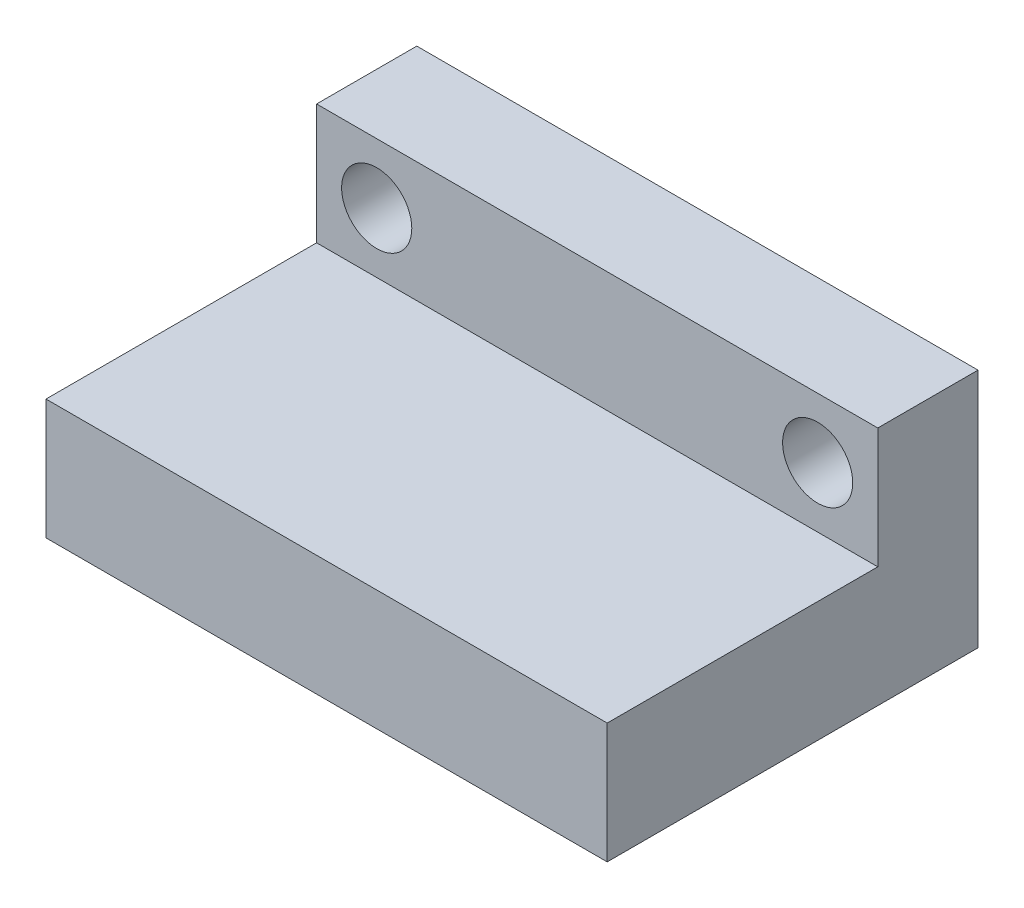
ISO-10303-21;
HEADER;
FILE_DESCRIPTION(('STEP AP214'),'2;1');
FILE_NAME('part.step','',(''),(''),'','','');
FILE_SCHEMA(('AUTOMOTIVE_DESIGN { 1 0 10303 214 1 1 1 1 }'));
ENDSEC;
DATA;
#1=APPLICATION_CONTEXT('core data for automotive mechanical design processes');
#2=APPLICATION_PROTOCOL_DEFINITION('international standard','automotive_design',2000,#1);
#3=PRODUCT_CONTEXT('',#1,'mechanical');
#4=PRODUCT('Part','Part','',(#3));
#5=PRODUCT_RELATED_PRODUCT_CATEGORY('part','',(#4));
#6=PRODUCT_DEFINITION_FORMATION('','',#4);
#7=PRODUCT_DEFINITION_CONTEXT('part definition',#1,'design');
#8=PRODUCT_DEFINITION('design','',#6,#7);
#9=PRODUCT_DEFINITION_SHAPE('','',#8);
#10=(LENGTH_UNIT() NAMED_UNIT(*) SI_UNIT(.MILLI.,.METRE.));
#11=(NAMED_UNIT(*) PLANE_ANGLE_UNIT() SI_UNIT($,.RADIAN.));
#12=(NAMED_UNIT(*) SI_UNIT($,.STERADIAN.) SOLID_ANGLE_UNIT());
#13=UNCERTAINTY_MEASURE_WITH_UNIT(LENGTH_MEASURE(1.E-05),#10,'distance_accuracy_value','');
#14=(GEOMETRIC_REPRESENTATION_CONTEXT(3) GLOBAL_UNCERTAINTY_ASSIGNED_CONTEXT((#13)) GLOBAL_UNIT_ASSIGNED_CONTEXT((#10,
#11,#12)) REPRESENTATION_CONTEXT('',''));
#15=CARTESIAN_POINT('',(0.,0.,0.));
#16=DIRECTION('',(0.,0.,1.));
#17=DIRECTION('',(1.,0.,0.));
#18=AXIS2_PLACEMENT_3D('',#15,#16,#17);
#19=CARTESIAN_POINT('',(14.,6.,5.));
#20=DIRECTION('',(-1.,0.,0.));
#21=DIRECTION('',(0.,0.,1.));
#22=AXIS2_PLACEMENT_3D('',#19,#20,#21);
#23=PLANE('',#22);
#24=DIRECTION('',(0.,1.,0.));
#25=VECTOR('',#24,1.);
#26=CARTESIAN_POINT('',(14.,6.,0.));
#27=LINE('',#26,#25);
#28=CARTESIAN_POINT('',(14.,-6.,0.));
#29=VERTEX_POINT('',#28);
#30=CARTESIAN_POINT('',(14.,6.,0.));
#31=VERTEX_POINT('',#30);
#32=EDGE_CURVE('E94',#29,#31,#27,.T.);
#33=ORIENTED_EDGE('',*,*,#32,.T.);
#34=DIRECTION('',(0.,0.,-1.));
#35=VECTOR('',#34,1.);
#36=CARTESIAN_POINT('',(14.,6.,5.));
#37=LINE('',#36,#35);
#38=CARTESIAN_POINT('',(14.,6.,5.));
#39=VERTEX_POINT('',#38);
#40=EDGE_CURVE('E11',#39,#31,#37,.T.);
#41=ORIENTED_EDGE('',*,*,#40,.F.);
#42=DIRECTION('',(0.,1.,0.));
#43=VECTOR('',#42,1.);
#44=CARTESIAN_POINT('',(14.,6.,5.));
#45=LINE('',#44,#43);
#46=CARTESIAN_POINT('',(14.,0.,5.));
#47=VERTEX_POINT('',#46);
#48=EDGE_CURVE('E87',#47,#39,#45,.T.);
#49=ORIENTED_EDGE('',*,*,#48,.F.);
#50=DIRECTION('',(0.,0.,-1.));
#51=VECTOR('',#50,1.);
#52=CARTESIAN_POINT('',(14.,0.,18.5));
#53=LINE('',#52,#51);
#54=CARTESIAN_POINT('',(14.,0.,18.5));
#55=VERTEX_POINT('',#54);
#56=EDGE_CURVE('E102',#55,#47,#53,.T.);
#57=ORIENTED_EDGE('',*,*,#56,.F.);
#58=DIRECTION('',(0.,1.,0.));
#59=VECTOR('',#58,1.);
#60=CARTESIAN_POINT('',(14.,-6.,18.5));
#61=LINE('',#60,#59);
#62=CARTESIAN_POINT('',(14.,-6.,18.5));
#63=VERTEX_POINT('',#62);
#64=EDGE_CURVE('E97',#63,#55,#61,.T.);
#65=ORIENTED_EDGE('',*,*,#64,.F.);
#66=DIRECTION('',(0.,0.,-1.));
#67=VECTOR('',#66,1.);
#68=CARTESIAN_POINT('',(14.,-6.,5.));
#69=LINE('',#68,#67);
#70=EDGE_CURVE('E80',#63,#29,#69,.T.);
#71=ORIENTED_EDGE('',*,*,#70,.T.);
#72=EDGE_LOOP('',(#33,#41,#49,#57,#65,#71));
#73=FACE_BOUND('',#72,.T.);
#74=ADVANCED_FACE('F33',(#73),#23,.F.);
#75=CARTESIAN_POINT('',(-14.,6.,5.));
#76=DIRECTION('',(0.,-1.,0.));
#77=DIRECTION('',(0.,0.,-1.));
#78=AXIS2_PLACEMENT_3D('',#75,#76,#77);
#79=PLANE('',#78);
#80=DIRECTION('',(-1.,0.,0.));
#81=VECTOR('',#80,1.);
#82=CARTESIAN_POINT('',(-14.,6.,0.));
#83=LINE('',#82,#81);
#84=CARTESIAN_POINT('',(-14.,6.,0.));
#85=VERTEX_POINT('',#84);
#86=EDGE_CURVE('E101',#31,#85,#83,.T.);
#87=ORIENTED_EDGE('',*,*,#86,.T.);
#88=DIRECTION('',(0.,0.,-1.));
#89=VECTOR('',#88,1.);
#90=CARTESIAN_POINT('',(-14.,6.,5.));
#91=LINE('',#90,#89);
#92=CARTESIAN_POINT('',(-14.,6.,5.));
#93=VERTEX_POINT('',#92);
#94=EDGE_CURVE('E41',#93,#85,#91,.T.);
#95=ORIENTED_EDGE('',*,*,#94,.F.);
#96=DIRECTION('',(-1.,0.,0.));
#97=VECTOR('',#96,1.);
#98=CARTESIAN_POINT('',(-14.,6.,5.));
#99=LINE('',#98,#97);
#100=EDGE_CURVE('E55',#39,#93,#99,.T.);
#101=ORIENTED_EDGE('',*,*,#100,.F.);
#102=ORIENTED_EDGE('',*,*,#40,.T.);
#103=EDGE_LOOP('',(#87,#95,#101,#102));
#104=FACE_BOUND('',#103,.T.);
#105=ADVANCED_FACE('F184',(#104),#79,.F.);
#106=CARTESIAN_POINT('',(-14.,6.,5.));
#107=DIRECTION('',(1.,0.,0.));
#108=DIRECTION('',(0.,0.,-1.));
#109=AXIS2_PLACEMENT_3D('',#106,#107,#108);
#110=PLANE('',#109);
#111=DIRECTION('',(0.,-1.,0.));
#112=VECTOR('',#111,1.);
#113=CARTESIAN_POINT('',(-14.,6.,0.));
#114=LINE('',#113,#112);
#115=CARTESIAN_POINT('',(-14.,-6.,0.));
#116=VERTEX_POINT('',#115);
#117=EDGE_CURVE('E88',#85,#116,#114,.T.);
#118=ORIENTED_EDGE('',*,*,#117,.T.);
#119=DIRECTION('',(0.,0.,-1.));
#120=VECTOR('',#119,1.);
#121=CARTESIAN_POINT('',(-14.,-6.,5.));
#122=LINE('',#121,#120);
#123=CARTESIAN_POINT('',(-14.,-6.,18.5));
#124=VERTEX_POINT('',#123);
#125=EDGE_CURVE('E83',#124,#116,#122,.T.);
#126=ORIENTED_EDGE('',*,*,#125,.F.);
#127=DIRECTION('',(0.,-1.,0.));
#128=VECTOR('',#127,1.);
#129=CARTESIAN_POINT('',(-14.,-6.,18.5));
#130=LINE('',#129,#128);
#131=CARTESIAN_POINT('',(-14.,0.,18.5));
#132=VERTEX_POINT('',#131);
#133=EDGE_CURVE('E133',#132,#124,#130,.T.);
#134=ORIENTED_EDGE('',*,*,#133,.F.);
#135=DIRECTION('',(0.,0.,-1.));
#136=VECTOR('',#135,1.);
#137=CARTESIAN_POINT('',(-14.,0.,18.5));
#138=LINE('',#137,#136);
#139=CARTESIAN_POINT('',(-14.,0.,5.));
#140=VERTEX_POINT('',#139);
#141=EDGE_CURVE('E106',#132,#140,#138,.T.);
#142=ORIENTED_EDGE('',*,*,#141,.T.);
#143=DIRECTION('',(0.,-1.,0.));
#144=VECTOR('',#143,1.);
#145=CARTESIAN_POINT('',(-14.,6.,5.));
#146=LINE('',#145,#144);
#147=EDGE_CURVE('E98',#93,#140,#146,.T.);
#148=ORIENTED_EDGE('',*,*,#147,.F.);
#149=ORIENTED_EDGE('',*,*,#94,.T.);
#150=EDGE_LOOP('',(#118,#126,#134,#142,#148,#149));
#151=FACE_BOUND('',#150,.T.);
#152=ADVANCED_FACE('F135',(#151),#110,.F.);
#153=CARTESIAN_POINT('',(-14.,-6.,5.));
#154=DIRECTION('',(0.,1.,0.));
#155=DIRECTION('',(0.,0.,1.));
#156=AXIS2_PLACEMENT_3D('',#153,#154,#155);
#157=PLANE('',#156);
#158=DIRECTION('',(1.,0.,0.));
#159=VECTOR('',#158,1.);
#160=CARTESIAN_POINT('',(-14.,-6.,0.));
#161=LINE('',#160,#159);
#162=EDGE_CURVE('E75',#116,#29,#161,.T.);
#163=ORIENTED_EDGE('',*,*,#162,.T.);
#164=ORIENTED_EDGE('',*,*,#70,.F.);
#165=DIRECTION('',(1.,0.,0.));
#166=VECTOR('',#165,1.);
#167=CARTESIAN_POINT('',(-14.,-6.,18.5));
#168=LINE('',#167,#166);
#169=EDGE_CURVE('E143',#124,#63,#168,.T.);
#170=ORIENTED_EDGE('',*,*,#169,.F.);
#171=ORIENTED_EDGE('',*,*,#125,.T.);
#172=EDGE_LOOP('',(#163,#164,#170,#171));
#173=FACE_BOUND('',#172,.T.);
#174=ADVANCED_FACE('F77',(#173),#157,.F.);
#175=CARTESIAN_POINT('',(0.,0.,5.));
#176=DIRECTION('',(0.,0.,1.));
#177=DIRECTION('',(1.,0.,0.));
#178=AXIS2_PLACEMENT_3D('',#175,#176,#177);
#179=PLANE('',#178);
#180=CARTESIAN_POINT('',(11.,3.,5.));
#181=DIRECTION('',(0.,0.,1.));
#182=DIRECTION('',(-1.,0.,0.));
#183=AXIS2_PLACEMENT_3D('',#180,#181,#182);
#184=CIRCLE('',#183,1.75);
#185=CARTESIAN_POINT('',(9.25,3.,5.));
#186=VERTEX_POINT('',#185);
#187=EDGE_CURVE('E154',#186,#186,#184,.T.);
#188=ORIENTED_EDGE('',*,*,#187,.F.);
#189=EDGE_LOOP('',(#188));
#190=FACE_BOUND('',#189,.T.);
#191=CARTESIAN_POINT('',(-11.,3.,5.));
#192=DIRECTION('',(0.,0.,1.));
#193=DIRECTION('',(1.,0.,0.));
#194=AXIS2_PLACEMENT_3D('',#191,#192,#193);
#195=CIRCLE('',#194,1.75);
#196=CARTESIAN_POINT('',(-9.25,3.,5.));
#197=VERTEX_POINT('',#196);
#198=EDGE_CURVE('E148',#197,#197,#195,.T.);
#199=ORIENTED_EDGE('',*,*,#198,.F.);
#200=EDGE_LOOP('',(#199));
#201=FACE_BOUND('',#200,.T.);
#202=DIRECTION('',(-1.,0.,0.));
#203=VECTOR('',#202,1.);
#204=CARTESIAN_POINT('',(-14.,0.,5.));
#205=LINE('',#204,#203);
#206=EDGE_CURVE('E49',#47,#140,#205,.T.);
#207=ORIENTED_EDGE('',*,*,#206,.F.);
#208=ORIENTED_EDGE('',*,*,#48,.T.);
#209=ORIENTED_EDGE('',*,*,#100,.T.);
#210=ORIENTED_EDGE('',*,*,#147,.T.);
#211=EDGE_LOOP('',(#207,#208,#209,#210));
#212=FACE_BOUND('',#211,.T.);
#213=ADVANCED_FACE('F124',(#190,#201,#212),#179,.T.);
#214=CARTESIAN_POINT('',(0.,0.,0.));
#215=DIRECTION('',(0.,0.,1.));
#216=DIRECTION('',(1.,0.,0.));
#217=AXIS2_PLACEMENT_3D('',#214,#215,#216);
#218=PLANE('',#217);
#219=CARTESIAN_POINT('',(11.,3.,0.));
#220=DIRECTION('',(0.,0.,1.));
#221=DIRECTION('',(-1.,0.,0.));
#222=AXIS2_PLACEMENT_3D('',#219,#220,#221);
#223=CIRCLE('',#222,1.75);
#224=CARTESIAN_POINT('',(9.25,3.,0.));
#225=VERTEX_POINT('',#224);
#226=EDGE_CURVE('E151',#225,#225,#223,.T.);
#227=ORIENTED_EDGE('',*,*,#226,.T.);
#228=EDGE_LOOP('',(#227));
#229=FACE_BOUND('',#228,.T.);
#230=CARTESIAN_POINT('',(-11.,3.,0.));
#231=DIRECTION('',(0.,0.,1.));
#232=DIRECTION('',(1.,0.,0.));
#233=AXIS2_PLACEMENT_3D('',#230,#231,#232);
#234=CIRCLE('',#233,1.75);
#235=CARTESIAN_POINT('',(-9.25,3.,0.));
#236=VERTEX_POINT('',#235);
#237=EDGE_CURVE('E134',#236,#236,#234,.T.);
#238=ORIENTED_EDGE('',*,*,#237,.T.);
#239=EDGE_LOOP('',(#238));
#240=FACE_BOUND('',#239,.T.);
#241=ORIENTED_EDGE('',*,*,#32,.F.);
#242=ORIENTED_EDGE('',*,*,#162,.F.);
#243=ORIENTED_EDGE('',*,*,#117,.F.);
#244=ORIENTED_EDGE('',*,*,#86,.F.);
#245=EDGE_LOOP('',(#241,#242,#243,#244));
#246=FACE_BOUND('',#245,.T.);
#247=ADVANCED_FACE('F100',(#229,#240,#246),#218,.F.);
#248=CARTESIAN_POINT('',(-14.,0.,18.5));
#249=DIRECTION('',(0.,-1.,0.));
#250=DIRECTION('',(0.,0.,-1.));
#251=AXIS2_PLACEMENT_3D('',#248,#249,#250);
#252=PLANE('',#251);
#253=ORIENTED_EDGE('',*,*,#206,.T.);
#254=ORIENTED_EDGE('',*,*,#141,.F.);
#255=DIRECTION('',(-1.,0.,0.));
#256=VECTOR('',#255,1.);
#257=CARTESIAN_POINT('',(-14.,0.,18.5));
#258=LINE('',#257,#256);
#259=EDGE_CURVE('E137',#55,#132,#258,.T.);
#260=ORIENTED_EDGE('',*,*,#259,.F.);
#261=ORIENTED_EDGE('',*,*,#56,.T.);
#262=EDGE_LOOP('',(#253,#254,#260,#261));
#263=FACE_BOUND('',#262,.T.);
#264=ADVANCED_FACE('F130',(#263),#252,.F.);
#265=CARTESIAN_POINT('',(0.,0.,18.5));
#266=DIRECTION('',(0.,0.,-1.));
#267=DIRECTION('',(-1.,0.,0.));
#268=AXIS2_PLACEMENT_3D('',#265,#266,#267);
#269=PLANE('',#268);
#270=ORIENTED_EDGE('',*,*,#133,.T.);
#271=ORIENTED_EDGE('',*,*,#169,.T.);
#272=ORIENTED_EDGE('',*,*,#64,.T.);
#273=ORIENTED_EDGE('',*,*,#259,.T.);
#274=EDGE_LOOP('',(#270,#271,#272,#273));
#275=FACE_BOUND('',#274,.T.);
#276=ADVANCED_FACE('F175',(#275),#269,.F.);
#277=CARTESIAN_POINT('',(-11.,3.,0.));
#278=DIRECTION('',(0.,0.,1.));
#279=DIRECTION('',(1.,0.,0.));
#280=AXIS2_PLACEMENT_3D('',#277,#278,#279);
#281=CYLINDRICAL_SURFACE('',#280,1.75);
#282=ORIENTED_EDGE('',*,*,#237,.F.);
#283=EDGE_LOOP('',(#282));
#284=FACE_BOUND('',#283,.T.);
#285=ORIENTED_EDGE('',*,*,#198,.T.);
#286=EDGE_LOOP('',(#285));
#287=FACE_BOUND('',#286,.T.);
#288=ADVANCED_FACE('F165',(#284,#287),#281,.F.);
#289=CARTESIAN_POINT('',(11.,3.,0.));
#290=DIRECTION('',(0.,0.,1.));
#291=DIRECTION('',(1.,0.,0.));
#292=AXIS2_PLACEMENT_3D('',#289,#290,#291);
#293=CYLINDRICAL_SURFACE('',#292,1.75);
#294=ORIENTED_EDGE('',*,*,#226,.F.);
#295=EDGE_LOOP('',(#294));
#296=FACE_BOUND('',#295,.T.);
#297=ORIENTED_EDGE('',*,*,#187,.T.);
#298=EDGE_LOOP('',(#297));
#299=FACE_BOUND('',#298,.T.);
#300=ADVANCED_FACE('F162',(#296,#299),#293,.F.);
#301=CLOSED_SHELL('',(#74,#105,#152,#174,#213,#247,#264,#276,#288,#300));
#302=MANIFOLD_SOLID_BREP('B2',#301);
#303=ADVANCED_BREP_SHAPE_REPRESENTATION('',(#18,#302),#14);
#304=SHAPE_DEFINITION_REPRESENTATION(#9,#303);
ENDSEC;
END-ISO-10303-21;
